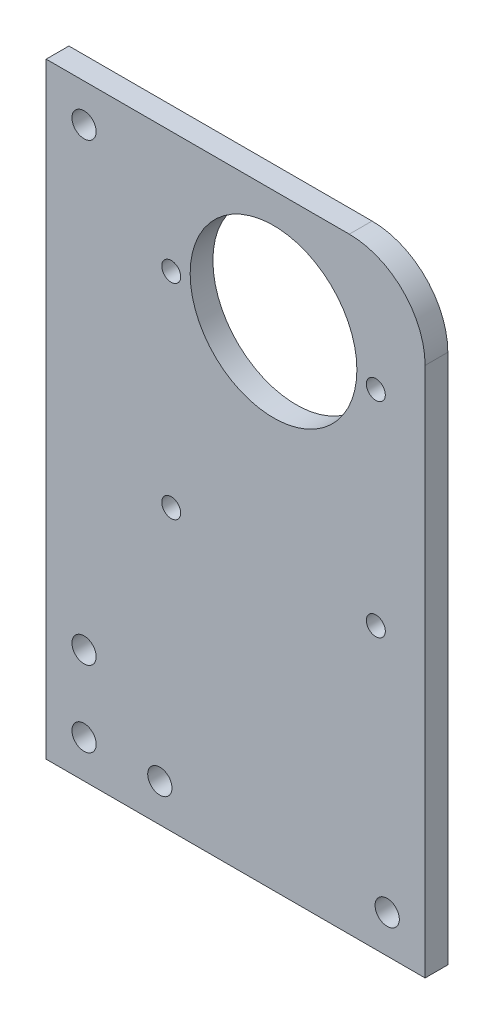
ISO-10303-21;
HEADER;
FILE_DESCRIPTION(('STEP AP214'),'2;1');
FILE_NAME('part.step','',(''),(''),'','','');
FILE_SCHEMA(('AUTOMOTIVE_DESIGN { 1 0 10303 214 1 1 1 1 }'));
ENDSEC;
DATA;
#1=APPLICATION_CONTEXT('core data for automotive mechanical design processes');
#2=APPLICATION_PROTOCOL_DEFINITION('international standard','automotive_design',2000,#1);
#3=PRODUCT_CONTEXT('',#1,'mechanical');
#4=PRODUCT('Part','Part','',(#3));
#5=PRODUCT_RELATED_PRODUCT_CATEGORY('part','',(#4));
#6=PRODUCT_DEFINITION_FORMATION('','',#4);
#7=PRODUCT_DEFINITION_CONTEXT('part definition',#1,'design');
#8=PRODUCT_DEFINITION('design','',#6,#7);
#9=PRODUCT_DEFINITION_SHAPE('','',#8);
#10=(LENGTH_UNIT() NAMED_UNIT(*) SI_UNIT(.MILLI.,.METRE.));
#11=(NAMED_UNIT(*) PLANE_ANGLE_UNIT() SI_UNIT($,.RADIAN.));
#12=(NAMED_UNIT(*) SI_UNIT($,.STERADIAN.) SOLID_ANGLE_UNIT());
#13=UNCERTAINTY_MEASURE_WITH_UNIT(LENGTH_MEASURE(1.E-05),#10,'distance_accuracy_value','');
#14=(GEOMETRIC_REPRESENTATION_CONTEXT(3) GLOBAL_UNCERTAINTY_ASSIGNED_CONTEXT((#13)) GLOBAL_UNIT_ASSIGNED_CONTEXT((#10,
#11,#12)) REPRESENTATION_CONTEXT('',''));
#15=CARTESIAN_POINT('',(0.,0.,0.));
#16=DIRECTION('',(0.,0.,1.));
#17=DIRECTION('',(1.,0.,0.));
#18=AXIS2_PLACEMENT_3D('',#15,#16,#17);
#19=CARTESIAN_POINT('',(-25.,-40.,3.));
#20=DIRECTION('',(1.,0.,0.));
#21=DIRECTION('',(0.,0.,-1.));
#22=AXIS2_PLACEMENT_3D('',#19,#20,#21);
#23=PLANE('',#22);
#24=DIRECTION('',(0.,-1.,0.));
#25=VECTOR('',#24,1.);
#26=CARTESIAN_POINT('',(-25.,-40.,0.));
#27=LINE('',#26,#25);
#28=CARTESIAN_POINT('',(-25.,40.,0.));
#29=VERTEX_POINT('',#28);
#30=CARTESIAN_POINT('',(-25.,-40.,0.));
#31=VERTEX_POINT('',#30);
#32=EDGE_CURVE('E102',#29,#31,#27,.T.);
#33=ORIENTED_EDGE('',*,*,#32,.T.);
#34=DIRECTION('',(0.,0.,-1.));
#35=VECTOR('',#34,1.);
#36=CARTESIAN_POINT('',(-25.,-40.,3.));
#37=LINE('',#36,#35);
#38=CARTESIAN_POINT('',(-25.,-40.,3.));
#39=VERTEX_POINT('',#38);
#40=EDGE_CURVE('E84',#39,#31,#37,.T.);
#41=ORIENTED_EDGE('',*,*,#40,.F.);
#42=DIRECTION('',(0.,-1.,0.));
#43=VECTOR('',#42,1.);
#44=CARTESIAN_POINT('',(-25.,-40.,3.));
#45=LINE('',#44,#43);
#46=CARTESIAN_POINT('',(-25.,40.,3.));
#47=VERTEX_POINT('',#46);
#48=EDGE_CURVE('E90',#47,#39,#45,.T.);
#49=ORIENTED_EDGE('',*,*,#48,.F.);
#50=DIRECTION('',(0.,0.,-1.));
#51=VECTOR('',#50,1.);
#52=CARTESIAN_POINT('',(-25.,40.,3.));
#53=LINE('',#52,#51);
#54=EDGE_CURVE('E107',#47,#29,#53,.T.);
#55=ORIENTED_EDGE('',*,*,#54,.T.);
#56=EDGE_LOOP('',(#33,#41,#49,#55));
#57=FACE_BOUND('',#56,.T.);
#58=ADVANCED_FACE('F33',(#57),#23,.F.);
#59=CARTESIAN_POINT('',(25.,-40.,3.));
#60=DIRECTION('',(0.,1.,0.));
#61=DIRECTION('',(-1.,0.,0.));
#62=AXIS2_PLACEMENT_3D('',#59,#60,#61);
#63=PLANE('',#62);
#64=DIRECTION('',(1.,0.,0.));
#65=VECTOR('',#64,1.);
#66=CARTESIAN_POINT('',(25.,-40.,0.));
#67=LINE('',#66,#65);
#68=CARTESIAN_POINT('',(25.,-40.,0.));
#69=VERTEX_POINT('',#68);
#70=EDGE_CURVE('E115',#31,#69,#67,.T.);
#71=ORIENTED_EDGE('',*,*,#70,.T.);
#72=DIRECTION('',(0.,0.,-1.));
#73=VECTOR('',#72,1.);
#74=CARTESIAN_POINT('',(25.,-40.,3.));
#75=LINE('',#74,#73);
#76=CARTESIAN_POINT('',(25.,-40.,3.));
#77=VERTEX_POINT('',#76);
#78=EDGE_CURVE('E87',#77,#69,#75,.T.);
#79=ORIENTED_EDGE('',*,*,#78,.F.);
#80=DIRECTION('',(1.,0.,0.));
#81=VECTOR('',#80,1.);
#82=CARTESIAN_POINT('',(25.,-40.,3.));
#83=LINE('',#82,#81);
#84=EDGE_CURVE('E80',#39,#77,#83,.T.);
#85=ORIENTED_EDGE('',*,*,#84,.F.);
#86=ORIENTED_EDGE('',*,*,#40,.T.);
#87=EDGE_LOOP('',(#71,#79,#85,#86));
#88=FACE_BOUND('',#87,.T.);
#89=ADVANCED_FACE('F82',(#88),#63,.F.);
#90=CARTESIAN_POINT('',(25.,-40.,3.));
#91=DIRECTION('',(-1.,0.,0.));
#92=DIRECTION('',(0.,0.,1.));
#93=AXIS2_PLACEMENT_3D('',#90,#91,#92);
#94=PLANE('',#93);
#95=DIRECTION('',(0.,1.,0.));
#96=VECTOR('',#95,1.);
#97=CARTESIAN_POINT('',(25.,-40.,0.));
#98=LINE('',#97,#96);
#99=CARTESIAN_POINT('',(25.,30.,0.));
#100=VERTEX_POINT('',#99);
#101=EDGE_CURVE('E113',#69,#100,#98,.T.);
#102=ORIENTED_EDGE('',*,*,#101,.T.);
#103=DIRECTION('',(0.,0.,-1.));
#104=VECTOR('',#103,1.);
#105=CARTESIAN_POINT('',(25.,30.,3.));
#106=LINE('',#105,#104);
#107=CARTESIAN_POINT('',(25.,30.,3.));
#108=VERTEX_POINT('',#107);
#109=EDGE_CURVE('E41',#100,#108,#106,.F.);
#110=ORIENTED_EDGE('',*,*,#109,.T.);
#111=DIRECTION('',(0.,1.,0.));
#112=VECTOR('',#111,1.);
#113=CARTESIAN_POINT('',(25.,-40.,3.));
#114=LINE('',#113,#112);
#115=EDGE_CURVE('E89',#77,#108,#114,.T.);
#116=ORIENTED_EDGE('',*,*,#115,.F.);
#117=ORIENTED_EDGE('',*,*,#78,.T.);
#118=EDGE_LOOP('',(#102,#110,#116,#117));
#119=FACE_BOUND('',#118,.T.);
#120=ADVANCED_FACE('F213',(#119),#94,.F.);
#121=CARTESIAN_POINT('',(25.,40.,3.));
#122=DIRECTION('',(0.,-1.,0.));
#123=DIRECTION('',(0.,0.,-1.));
#124=AXIS2_PLACEMENT_3D('',#121,#122,#123);
#125=PLANE('',#124);
#126=DIRECTION('',(-1.,0.,0.));
#127=VECTOR('',#126,1.);
#128=CARTESIAN_POINT('',(25.,40.,3.));
#129=LINE('',#128,#127);
#130=CARTESIAN_POINT('',(15.,40.,3.));
#131=VERTEX_POINT('',#130);
#132=EDGE_CURVE('E95',#131,#47,#129,.T.);
#133=ORIENTED_EDGE('',*,*,#132,.F.);
#134=DIRECTION('',(0.,0.,-1.));
#135=VECTOR('',#134,1.);
#136=CARTESIAN_POINT('',(15.,40.,3.));
#137=LINE('',#136,#135);
#138=CARTESIAN_POINT('',(15.,40.,0.));
#139=VERTEX_POINT('',#138);
#140=EDGE_CURVE('E103',#131,#139,#137,.T.);
#141=ORIENTED_EDGE('',*,*,#140,.T.);
#142=DIRECTION('',(-1.,0.,0.));
#143=VECTOR('',#142,1.);
#144=CARTESIAN_POINT('',(25.,40.,0.));
#145=LINE('',#144,#143);
#146=EDGE_CURVE('E99',#139,#29,#145,.T.);
#147=ORIENTED_EDGE('',*,*,#146,.T.);
#148=ORIENTED_EDGE('',*,*,#54,.F.);
#149=EDGE_LOOP('',(#133,#141,#147,#148));
#150=FACE_BOUND('',#149,.T.);
#151=ADVANCED_FACE('F194',(#150),#125,.F.);
#152=CARTESIAN_POINT('',(0.,0.,3.));
#153=DIRECTION('',(0.,0.,1.));
#154=DIRECTION('',(1.,0.,0.));
#155=AXIS2_PLACEMENT_3D('',#152,#153,#154);
#156=PLANE('',#155);
#157=CARTESIAN_POINT('',(18.5,-3.,3.));
#158=DIRECTION('',(0.,0.,1.));
#159=DIRECTION('',(1.,0.,0.));
#160=AXIS2_PLACEMENT_3D('',#157,#158,#159);
#161=CIRCLE('',#160,1.25);
#162=CARTESIAN_POINT('',(19.75,-3.,3.));
#163=VERTEX_POINT('',#162);
#164=EDGE_CURVE('E158',#163,#163,#161,.T.);
#165=ORIENTED_EDGE('',*,*,#164,.F.);
#166=EDGE_LOOP('',(#165));
#167=FACE_BOUND('',#166,.T.);
#168=CARTESIAN_POINT('',(-20.,-35.,3.));
#169=DIRECTION('',(0.,0.,1.));
#170=DIRECTION('',(1.,0.,0.));
#171=AXIS2_PLACEMENT_3D('',#168,#169,#170);
#172=CIRCLE('',#171,1.6);
#173=CARTESIAN_POINT('',(-18.4,-35.,3.));
#174=VERTEX_POINT('',#173);
#175=EDGE_CURVE('E151',#174,#174,#172,.T.);
#176=ORIENTED_EDGE('',*,*,#175,.F.);
#177=EDGE_LOOP('',(#176));
#178=FACE_BOUND('',#177,.T.);
#179=CARTESIAN_POINT('',(-10.,-35.,3.));
#180=DIRECTION('',(0.,0.,1.));
#181=DIRECTION('',(1.,0.,0.));
#182=AXIS2_PLACEMENT_3D('',#179,#180,#181);
#183=CIRCLE('',#182,1.6);
#184=CARTESIAN_POINT('',(-8.4,-35.,3.));
#185=VERTEX_POINT('',#184);
#186=EDGE_CURVE('E170',#185,#185,#183,.T.);
#187=ORIENTED_EDGE('',*,*,#186,.F.);
#188=EDGE_LOOP('',(#187));
#189=FACE_BOUND('',#188,.T.);
#190=CARTESIAN_POINT('',(20.,-35.,3.));
#191=DIRECTION('',(0.,0.,1.));
#192=DIRECTION('',(1.,0.,0.));
#193=AXIS2_PLACEMENT_3D('',#190,#191,#192);
#194=CIRCLE('',#193,1.60000000000001);
#195=CARTESIAN_POINT('',(21.6,-35.,3.));
#196=VERTEX_POINT('',#195);
#197=EDGE_CURVE('E163',#196,#196,#194,.T.);
#198=ORIENTED_EDGE('',*,*,#197,.F.);
#199=EDGE_LOOP('',(#198));
#200=FACE_BOUND('',#199,.T.);
#201=CARTESIAN_POINT('',(18.5,24.,3.));
#202=DIRECTION('',(0.,0.,1.));
#203=DIRECTION('',(1.,0.,0.));
#204=AXIS2_PLACEMENT_3D('',#201,#202,#203);
#205=CIRCLE('',#204,1.25);
#206=CARTESIAN_POINT('',(19.75,24.,3.));
#207=VERTEX_POINT('',#206);
#208=EDGE_CURVE('E134',#207,#207,#205,.T.);
#209=ORIENTED_EDGE('',*,*,#208,.F.);
#210=EDGE_LOOP('',(#209));
#211=FACE_BOUND('',#210,.T.);
#212=CARTESIAN_POINT('',(-20.,35.,3.));
#213=DIRECTION('',(0.,0.,1.));
#214=DIRECTION('',(1.,0.,0.));
#215=AXIS2_PLACEMENT_3D('',#212,#213,#214);
#216=CIRCLE('',#215,1.6);
#217=CARTESIAN_POINT('',(-18.4,35.,3.));
#218=VERTEX_POINT('',#217);
#219=EDGE_CURVE('E127',#218,#218,#216,.T.);
#220=ORIENTED_EDGE('',*,*,#219,.F.);
#221=EDGE_LOOP('',(#220));
#222=FACE_BOUND('',#221,.T.);
#223=CARTESIAN_POINT('',(-20.,-25.,3.));
#224=DIRECTION('',(0.,0.,1.));
#225=DIRECTION('',(1.,0.,0.));
#226=AXIS2_PLACEMENT_3D('',#223,#224,#225);
#227=CIRCLE('',#226,1.6);
#228=CARTESIAN_POINT('',(-18.4,-25.,3.));
#229=VERTEX_POINT('',#228);
#230=EDGE_CURVE('E146',#229,#229,#227,.T.);
#231=ORIENTED_EDGE('',*,*,#230,.F.);
#232=EDGE_LOOP('',(#231));
#233=FACE_BOUND('',#232,.T.);
#234=CARTESIAN_POINT('',(-8.50000000000001,24.,3.));
#235=DIRECTION('',(0.,0.,1.));
#236=DIRECTION('',(1.,0.,0.));
#237=AXIS2_PLACEMENT_3D('',#234,#235,#236);
#238=CIRCLE('',#237,1.25);
#239=CARTESIAN_POINT('',(-7.25000000000001,24.,3.));
#240=VERTEX_POINT('',#239);
#241=EDGE_CURVE('E139',#240,#240,#238,.T.);
#242=ORIENTED_EDGE('',*,*,#241,.F.);
#243=EDGE_LOOP('',(#242));
#244=FACE_BOUND('',#243,.T.);
#245=CARTESIAN_POINT('',(-8.50000000000001,-3.00000000000001,3.));
#246=DIRECTION('',(0.,0.,1.));
#247=DIRECTION('',(1.,0.,0.));
#248=AXIS2_PLACEMENT_3D('',#245,#246,#247);
#249=CIRCLE('',#248,1.25);
#250=CARTESIAN_POINT('',(-7.25000000000001,-3.00000000000001,3.));
#251=VERTEX_POINT('',#250);
#252=EDGE_CURVE('E175',#251,#251,#249,.T.);
#253=ORIENTED_EDGE('',*,*,#252,.F.);
#254=EDGE_LOOP('',(#253));
#255=FACE_BOUND('',#254,.T.);
#256=CARTESIAN_POINT('',(4.99999999999999,25.,3.));
#257=DIRECTION('',(0.,0.,1.));
#258=DIRECTION('',(1.,0.,0.));
#259=AXIS2_PLACEMENT_3D('',#256,#257,#258);
#260=CIRCLE('',#259,11.);
#261=CARTESIAN_POINT('',(16.,25.,3.));
#262=VERTEX_POINT('',#261);
#263=EDGE_CURVE('E121',#262,#262,#260,.T.);
#264=ORIENTED_EDGE('',*,*,#263,.F.);
#265=EDGE_LOOP('',(#264));
#266=FACE_BOUND('',#265,.T.);
#267=ORIENTED_EDGE('',*,*,#115,.T.);
#268=CARTESIAN_POINT('',(15.,30.,3.));
#269=DIRECTION('',(0.,0.,1.));
#270=DIRECTION('',(1.,0.,0.));
#271=AXIS2_PLACEMENT_3D('',#268,#269,#270);
#272=CIRCLE('',#271,10.);
#273=EDGE_CURVE('E11',#108,#131,#272,.T.);
#274=ORIENTED_EDGE('',*,*,#273,.T.);
#275=ORIENTED_EDGE('',*,*,#132,.T.);
#276=ORIENTED_EDGE('',*,*,#48,.T.);
#277=ORIENTED_EDGE('',*,*,#84,.T.);
#278=EDGE_LOOP('',(#267,#274,#275,#276,#277));
#279=FACE_BOUND('',#278,.T.);
#280=ADVANCED_FACE('F93',(#167,#178,#189,#200,#211,#222,#233,#244,#255,#266,#279),#156,.T.);
#281=CARTESIAN_POINT('',(0.,0.,0.));
#282=DIRECTION('',(0.,0.,1.));
#283=DIRECTION('',(1.,0.,0.));
#284=AXIS2_PLACEMENT_3D('',#281,#282,#283);
#285=PLANE('',#284);
#286=CARTESIAN_POINT('',(18.5,-3.,0.));
#287=DIRECTION('',(0.,0.,1.));
#288=DIRECTION('',(1.,0.,0.));
#289=AXIS2_PLACEMENT_3D('',#286,#287,#288);
#290=CIRCLE('',#289,1.25);
#291=CARTESIAN_POINT('',(19.75,-3.,0.));
#292=VERTEX_POINT('',#291);
#293=EDGE_CURVE('E143',#292,#292,#290,.T.);
#294=ORIENTED_EDGE('',*,*,#293,.T.);
#295=EDGE_LOOP('',(#294));
#296=FACE_BOUND('',#295,.T.);
#297=CARTESIAN_POINT('',(-20.,-35.,0.));
#298=DIRECTION('',(0.,0.,1.));
#299=DIRECTION('',(1.,0.,0.));
#300=AXIS2_PLACEMENT_3D('',#297,#298,#299);
#301=CIRCLE('',#300,1.6);
#302=CARTESIAN_POINT('',(-18.4,-35.,0.));
#303=VERTEX_POINT('',#302);
#304=EDGE_CURVE('E154',#303,#303,#301,.T.);
#305=ORIENTED_EDGE('',*,*,#304,.T.);
#306=EDGE_LOOP('',(#305));
#307=FACE_BOUND('',#306,.T.);
#308=CARTESIAN_POINT('',(-10.,-35.,0.));
#309=DIRECTION('',(0.,0.,1.));
#310=DIRECTION('',(1.,0.,0.));
#311=AXIS2_PLACEMENT_3D('',#308,#309,#310);
#312=CIRCLE('',#311,1.6);
#313=CARTESIAN_POINT('',(-8.4,-35.,0.));
#314=VERTEX_POINT('',#313);
#315=EDGE_CURVE('E155',#314,#314,#312,.T.);
#316=ORIENTED_EDGE('',*,*,#315,.T.);
#317=EDGE_LOOP('',(#316));
#318=FACE_BOUND('',#317,.T.);
#319=CARTESIAN_POINT('',(20.,-35.,0.));
#320=DIRECTION('',(0.,0.,1.));
#321=DIRECTION('',(1.,0.,0.));
#322=AXIS2_PLACEMENT_3D('',#319,#320,#321);
#323=CIRCLE('',#322,1.60000000000001);
#324=CARTESIAN_POINT('',(21.6,-35.,0.));
#325=VERTEX_POINT('',#324);
#326=EDGE_CURVE('E166',#325,#325,#323,.T.);
#327=ORIENTED_EDGE('',*,*,#326,.T.);
#328=EDGE_LOOP('',(#327));
#329=FACE_BOUND('',#328,.T.);
#330=CARTESIAN_POINT('',(18.5,24.,0.));
#331=DIRECTION('',(0.,0.,1.));
#332=DIRECTION('',(1.,0.,0.));
#333=AXIS2_PLACEMENT_3D('',#330,#331,#332);
#334=CIRCLE('',#333,1.25);
#335=CARTESIAN_POINT('',(19.75,24.,0.));
#336=VERTEX_POINT('',#335);
#337=EDGE_CURVE('E124',#336,#336,#334,.T.);
#338=ORIENTED_EDGE('',*,*,#337,.T.);
#339=EDGE_LOOP('',(#338));
#340=FACE_BOUND('',#339,.T.);
#341=CARTESIAN_POINT('',(-20.,35.,0.));
#342=DIRECTION('',(0.,0.,1.));
#343=DIRECTION('',(1.,0.,0.));
#344=AXIS2_PLACEMENT_3D('',#341,#342,#343);
#345=CIRCLE('',#344,1.6);
#346=CARTESIAN_POINT('',(-18.4,35.,0.));
#347=VERTEX_POINT('',#346);
#348=EDGE_CURVE('E130',#347,#347,#345,.T.);
#349=ORIENTED_EDGE('',*,*,#348,.T.);
#350=EDGE_LOOP('',(#349));
#351=FACE_BOUND('',#350,.T.);
#352=CARTESIAN_POINT('',(-20.,-25.,0.));
#353=DIRECTION('',(0.,0.,1.));
#354=DIRECTION('',(1.,0.,0.));
#355=AXIS2_PLACEMENT_3D('',#352,#353,#354);
#356=CIRCLE('',#355,1.6);
#357=CARTESIAN_POINT('',(-18.4,-25.,0.));
#358=VERTEX_POINT('',#357);
#359=EDGE_CURVE('E131',#358,#358,#356,.T.);
#360=ORIENTED_EDGE('',*,*,#359,.T.);
#361=EDGE_LOOP('',(#360));
#362=FACE_BOUND('',#361,.T.);
#363=CARTESIAN_POINT('',(-8.50000000000001,24.,0.));
#364=DIRECTION('',(0.,0.,1.));
#365=DIRECTION('',(1.,0.,0.));
#366=AXIS2_PLACEMENT_3D('',#363,#364,#365);
#367=CIRCLE('',#366,1.25);
#368=CARTESIAN_POINT('',(-7.25000000000001,24.,0.));
#369=VERTEX_POINT('',#368);
#370=EDGE_CURVE('E142',#369,#369,#367,.T.);
#371=ORIENTED_EDGE('',*,*,#370,.T.);
#372=EDGE_LOOP('',(#371));
#373=FACE_BOUND('',#372,.T.);
#374=CARTESIAN_POINT('',(-8.50000000000001,-3.00000000000001,0.));
#375=DIRECTION('',(0.,0.,1.));
#376=DIRECTION('',(1.,0.,0.));
#377=AXIS2_PLACEMENT_3D('',#374,#375,#376);
#378=CIRCLE('',#377,1.25);
#379=CARTESIAN_POINT('',(-7.25000000000001,-3.00000000000001,0.));
#380=VERTEX_POINT('',#379);
#381=EDGE_CURVE('E167',#380,#380,#378,.T.);
#382=ORIENTED_EDGE('',*,*,#381,.T.);
#383=EDGE_LOOP('',(#382));
#384=FACE_BOUND('',#383,.T.);
#385=CARTESIAN_POINT('',(4.99999999999999,25.,0.));
#386=DIRECTION('',(0.,0.,1.));
#387=DIRECTION('',(1.,0.,0.));
#388=AXIS2_PLACEMENT_3D('',#385,#386,#387);
#389=CIRCLE('',#388,11.);
#390=CARTESIAN_POINT('',(16.,25.,0.));
#391=VERTEX_POINT('',#390);
#392=EDGE_CURVE('E118',#391,#391,#389,.T.);
#393=ORIENTED_EDGE('',*,*,#392,.T.);
#394=EDGE_LOOP('',(#393));
#395=FACE_BOUND('',#394,.T.);
#396=ORIENTED_EDGE('',*,*,#146,.F.);
#397=CARTESIAN_POINT('',(15.,30.,0.));
#398=DIRECTION('',(0.,0.,1.));
#399=DIRECTION('',(1.,0.,0.));
#400=AXIS2_PLACEMENT_3D('',#397,#398,#399);
#401=CIRCLE('',#400,10.);
#402=EDGE_CURVE('E55',#139,#100,#401,.F.);
#403=ORIENTED_EDGE('',*,*,#402,.T.);
#404=ORIENTED_EDGE('',*,*,#101,.F.);
#405=ORIENTED_EDGE('',*,*,#70,.F.);
#406=ORIENTED_EDGE('',*,*,#32,.F.);
#407=EDGE_LOOP('',(#396,#403,#404,#405,#406));
#408=FACE_BOUND('',#407,.T.);
#409=ADVANCED_FACE('F181',(#296,#307,#318,#329,#340,#351,#362,#373,#384,#395,#408),#285,.F.);
#410=CARTESIAN_POINT('',(4.99999999999999,25.,0.));
#411=DIRECTION('',(0.,0.,1.));
#412=DIRECTION('',(1.,0.,0.));
#413=AXIS2_PLACEMENT_3D('',#410,#411,#412);
#414=CYLINDRICAL_SURFACE('',#413,11.);
#415=ORIENTED_EDGE('',*,*,#392,.F.);
#416=EDGE_LOOP('',(#415));
#417=FACE_BOUND('',#416,.T.);
#418=ORIENTED_EDGE('',*,*,#263,.T.);
#419=EDGE_LOOP('',(#418));
#420=FACE_BOUND('',#419,.T.);
#421=ADVANCED_FACE('F188',(#417,#420),#414,.F.);
#422=CARTESIAN_POINT('',(-8.50000000000001,-3.00000000000001,0.));
#423=DIRECTION('',(0.,0.,1.));
#424=DIRECTION('',(1.,0.,0.));
#425=AXIS2_PLACEMENT_3D('',#422,#423,#424);
#426=CYLINDRICAL_SURFACE('',#425,1.25);
#427=ORIENTED_EDGE('',*,*,#381,.F.);
#428=EDGE_LOOP('',(#427));
#429=FACE_BOUND('',#428,.T.);
#430=ORIENTED_EDGE('',*,*,#252,.T.);
#431=EDGE_LOOP('',(#430));
#432=FACE_BOUND('',#431,.T.);
#433=ADVANCED_FACE('F184',(#429,#432),#426,.F.);
#434=CARTESIAN_POINT('',(-8.50000000000001,24.,0.));
#435=DIRECTION('',(0.,0.,1.));
#436=DIRECTION('',(1.,0.,0.));
#437=AXIS2_PLACEMENT_3D('',#434,#435,#436);
#438=CYLINDRICAL_SURFACE('',#437,1.25);
#439=ORIENTED_EDGE('',*,*,#370,.F.);
#440=EDGE_LOOP('',(#439));
#441=FACE_BOUND('',#440,.T.);
#442=ORIENTED_EDGE('',*,*,#241,.T.);
#443=EDGE_LOOP('',(#442));
#444=FACE_BOUND('',#443,.T.);
#445=ADVANCED_FACE('F187',(#441,#444),#438,.F.);
#446=CARTESIAN_POINT('',(-20.,-25.,0.));
#447=DIRECTION('',(0.,0.,1.));
#448=DIRECTION('',(1.,0.,0.));
#449=AXIS2_PLACEMENT_3D('',#446,#447,#448);
#450=CYLINDRICAL_SURFACE('',#449,1.6);
#451=ORIENTED_EDGE('',*,*,#359,.F.);
#452=EDGE_LOOP('',(#451));
#453=FACE_BOUND('',#452,.T.);
#454=ORIENTED_EDGE('',*,*,#230,.T.);
#455=EDGE_LOOP('',(#454));
#456=FACE_BOUND('',#455,.T.);
#457=ADVANCED_FACE('F245',(#453,#456),#450,.F.);
#458=CARTESIAN_POINT('',(-20.,35.,0.));
#459=DIRECTION('',(0.,0.,1.));
#460=DIRECTION('',(1.,0.,0.));
#461=AXIS2_PLACEMENT_3D('',#458,#459,#460);
#462=CYLINDRICAL_SURFACE('',#461,1.6);
#463=ORIENTED_EDGE('',*,*,#348,.F.);
#464=EDGE_LOOP('',(#463));
#465=FACE_BOUND('',#464,.T.);
#466=ORIENTED_EDGE('',*,*,#219,.T.);
#467=EDGE_LOOP('',(#466));
#468=FACE_BOUND('',#467,.T.);
#469=ADVANCED_FACE('F248',(#465,#468),#462,.F.);
#470=CARTESIAN_POINT('',(18.5,24.,0.));
#471=DIRECTION('',(0.,0.,1.));
#472=DIRECTION('',(1.,0.,0.));
#473=AXIS2_PLACEMENT_3D('',#470,#471,#472);
#474=CYLINDRICAL_SURFACE('',#473,1.25);
#475=ORIENTED_EDGE('',*,*,#337,.F.);
#476=EDGE_LOOP('',(#475));
#477=FACE_BOUND('',#476,.T.);
#478=ORIENTED_EDGE('',*,*,#208,.T.);
#479=EDGE_LOOP('',(#478));
#480=FACE_BOUND('',#479,.T.);
#481=ADVANCED_FACE('F253',(#477,#480),#474,.F.);
#482=CARTESIAN_POINT('',(20.,-35.,0.));
#483=DIRECTION('',(0.,0.,1.));
#484=DIRECTION('',(1.,0.,0.));
#485=AXIS2_PLACEMENT_3D('',#482,#483,#484);
#486=CYLINDRICAL_SURFACE('',#485,1.60000000000001);
#487=ORIENTED_EDGE('',*,*,#326,.F.);
#488=EDGE_LOOP('',(#487));
#489=FACE_BOUND('',#488,.T.);
#490=ORIENTED_EDGE('',*,*,#197,.T.);
#491=EDGE_LOOP('',(#490));
#492=FACE_BOUND('',#491,.T.);
#493=ADVANCED_FACE('F242',(#489,#492),#486,.F.);
#494=CARTESIAN_POINT('',(-10.,-35.,0.));
#495=DIRECTION('',(0.,0.,1.));
#496=DIRECTION('',(1.,0.,0.));
#497=AXIS2_PLACEMENT_3D('',#494,#495,#496);
#498=CYLINDRICAL_SURFACE('',#497,1.6);
#499=ORIENTED_EDGE('',*,*,#315,.F.);
#500=EDGE_LOOP('',(#499));
#501=FACE_BOUND('',#500,.T.);
#502=ORIENTED_EDGE('',*,*,#186,.T.);
#503=EDGE_LOOP('',(#502));
#504=FACE_BOUND('',#503,.T.);
#505=ADVANCED_FACE('F236',(#501,#504),#498,.F.);
#506=CARTESIAN_POINT('',(-20.,-35.,0.));
#507=DIRECTION('',(0.,0.,1.));
#508=DIRECTION('',(1.,0.,0.));
#509=AXIS2_PLACEMENT_3D('',#506,#507,#508);
#510=CYLINDRICAL_SURFACE('',#509,1.6);
#511=ORIENTED_EDGE('',*,*,#304,.F.);
#512=EDGE_LOOP('',(#511));
#513=FACE_BOUND('',#512,.T.);
#514=ORIENTED_EDGE('',*,*,#175,.T.);
#515=EDGE_LOOP('',(#514));
#516=FACE_BOUND('',#515,.T.);
#517=ADVANCED_FACE('F230',(#513,#516),#510,.F.);
#518=CARTESIAN_POINT('',(18.5,-3.,0.));
#519=DIRECTION('',(0.,0.,1.));
#520=DIRECTION('',(1.,0.,0.));
#521=AXIS2_PLACEMENT_3D('',#518,#519,#520);
#522=CYLINDRICAL_SURFACE('',#521,1.25);
#523=ORIENTED_EDGE('',*,*,#293,.F.);
#524=EDGE_LOOP('',(#523));
#525=FACE_BOUND('',#524,.T.);
#526=ORIENTED_EDGE('',*,*,#164,.T.);
#527=EDGE_LOOP('',(#526));
#528=FACE_BOUND('',#527,.T.);
#529=ADVANCED_FACE('F226',(#525,#528),#522,.F.);
#530=CARTESIAN_POINT('',(15.,30.,3.));
#531=DIRECTION('',(0.,0.,-1.));
#532=DIRECTION('',(-1.,0.,0.));
#533=AXIS2_PLACEMENT_3D('',#530,#531,#532);
#534=CYLINDRICAL_SURFACE('',#533,10.);
#535=ORIENTED_EDGE('',*,*,#273,.F.);
#536=ORIENTED_EDGE('',*,*,#109,.F.);
#537=ORIENTED_EDGE('',*,*,#402,.F.);
#538=ORIENTED_EDGE('',*,*,#140,.F.);
#539=EDGE_LOOP('',(#535,#536,#537,#538));
#540=FACE_BOUND('',#539,.T.);
#541=ADVANCED_FACE('F35',(#540),#534,.T.);
#542=CLOSED_SHELL('',(#58,#89,#120,#151,#280,#409,#421,#433,#445,#457,#469,#481,#493,#505,#517,
#529,#541));
#543=MANIFOLD_SOLID_BREP('B2',#542);
#544=ADVANCED_BREP_SHAPE_REPRESENTATION('',(#18,#543),#14);
#545=SHAPE_DEFINITION_REPRESENTATION(#9,#544);
ENDSEC;
END-ISO-10303-21;
